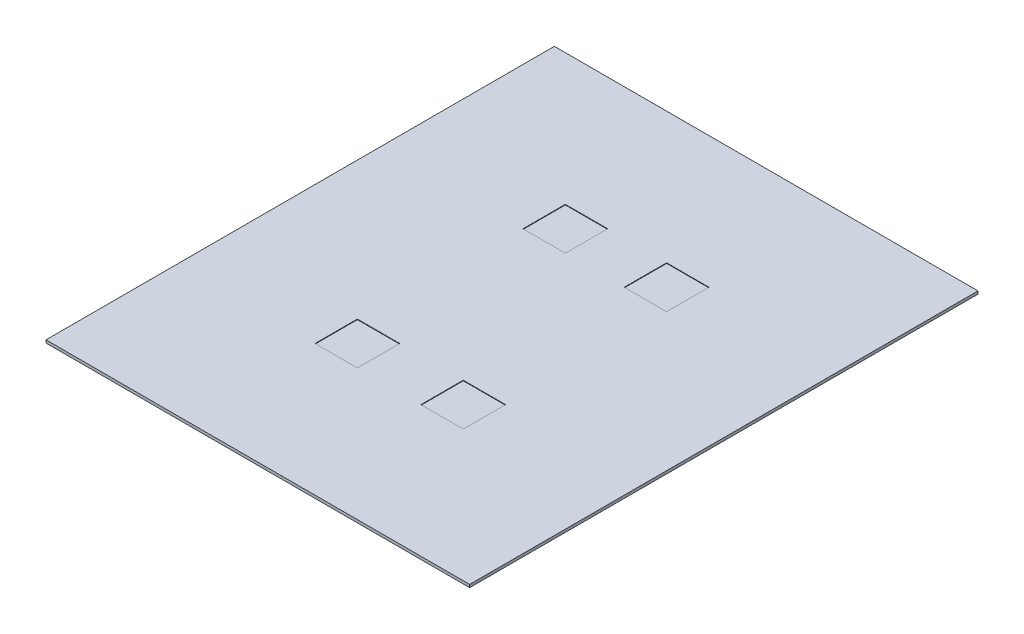
ISO-10303-21;
HEADER;
FILE_DESCRIPTION(('STEP AP214'),'2;1');
FILE_NAME('part.step','',(''),(''),'','','');
FILE_SCHEMA(('AUTOMOTIVE_DESIGN { 1 0 10303 214 1 1 1 1 }'));
ENDSEC;
DATA;
#1=APPLICATION_CONTEXT('core data for automotive mechanical design processes');
#2=APPLICATION_PROTOCOL_DEFINITION('international standard','automotive_design',2000,#1);
#3=PRODUCT_CONTEXT('',#1,'mechanical');
#4=PRODUCT('Part','Part','',(#3));
#5=PRODUCT_RELATED_PRODUCT_CATEGORY('part','',(#4));
#6=PRODUCT_DEFINITION_FORMATION('','',#4);
#7=PRODUCT_DEFINITION_CONTEXT('part definition',#1,'design');
#8=PRODUCT_DEFINITION('design','',#6,#7);
#9=PRODUCT_DEFINITION_SHAPE('','',#8);
#10=(LENGTH_UNIT() NAMED_UNIT(*) SI_UNIT(.MILLI.,.METRE.));
#11=(NAMED_UNIT(*) PLANE_ANGLE_UNIT() SI_UNIT($,.RADIAN.));
#12=(NAMED_UNIT(*) SI_UNIT($,.STERADIAN.) SOLID_ANGLE_UNIT());
#13=UNCERTAINTY_MEASURE_WITH_UNIT(LENGTH_MEASURE(1.E-05),#10,'distance_accuracy_value','');
#14=(GEOMETRIC_REPRESENTATION_CONTEXT(3) GLOBAL_UNCERTAINTY_ASSIGNED_CONTEXT((#13)) GLOBAL_UNIT_ASSIGNED_CONTEXT((#10,
#11,#12)) REPRESENTATION_CONTEXT('',''));
#15=CARTESIAN_POINT('',(0.,0.,0.));
#16=DIRECTION('',(0.,0.,1.));
#17=DIRECTION('',(1.,0.,0.));
#18=AXIS2_PLACEMENT_3D('',#15,#16,#17);
#19=CARTESIAN_POINT('',(-3750.,50.,4500.));
#20=DIRECTION('',(1.,0.,0.));
#21=DIRECTION('',(0.,0.,-1.));
#22=AXIS2_PLACEMENT_3D('',#19,#20,#21);
#23=PLANE('',#22);
#24=DIRECTION('',(0.,0.,1.));
#25=VECTOR('',#24,1.);
#26=CARTESIAN_POINT('',(-3750.,0.,4500.));
#27=LINE('',#26,#25);
#28=CARTESIAN_POINT('',(-3750.,0.,-4500.));
#29=VERTEX_POINT('',#28);
#30=CARTESIAN_POINT('',(-3750.,0.,4500.));
#31=VERTEX_POINT('',#30);
#32=EDGE_CURVE('E297',#29,#31,#27,.T.);
#33=ORIENTED_EDGE('',*,*,#32,.T.);
#34=DIRECTION('',(0.,-1.,0.));
#35=VECTOR('',#34,1.);
#36=CARTESIAN_POINT('',(-3750.,50.,4500.));
#37=LINE('',#36,#35);
#38=CARTESIAN_POINT('',(-3750.,50.,4500.));
#39=VERTEX_POINT('',#38);
#40=EDGE_CURVE('E11',#39,#31,#37,.T.);
#41=ORIENTED_EDGE('',*,*,#40,.F.);
#42=DIRECTION('',(0.,0.,1.));
#43=VECTOR('',#42,1.);
#44=CARTESIAN_POINT('',(-3750.,50.,4500.));
#45=LINE('',#44,#43);
#46=CARTESIAN_POINT('',(-3750.,50.,-4500.));
#47=VERTEX_POINT('',#46);
#48=EDGE_CURVE('E304',#47,#39,#45,.T.);
#49=ORIENTED_EDGE('',*,*,#48,.F.);
#50=DIRECTION('',(0.,-1.,0.));
#51=VECTOR('',#50,1.);
#52=CARTESIAN_POINT('',(-3750.,50.,-4500.));
#53=LINE('',#52,#51);
#54=EDGE_CURVE('E314',#47,#29,#53,.T.);
#55=ORIENTED_EDGE('',*,*,#54,.T.);
#56=EDGE_LOOP('',(#33,#41,#49,#55));
#57=FACE_BOUND('',#56,.T.);
#58=ADVANCED_FACE('F33',(#57),#23,.F.);
#59=CARTESIAN_POINT('',(3750.,50.,4500.));
#60=DIRECTION('',(0.,0.,-1.));
#61=DIRECTION('',(-1.,0.,0.));
#62=AXIS2_PLACEMENT_3D('',#59,#60,#61);
#63=PLANE('',#62);
#64=DIRECTION('',(1.,0.,0.));
#65=VECTOR('',#64,1.);
#66=CARTESIAN_POINT('',(3750.,0.,4500.));
#67=LINE('',#66,#65);
#68=CARTESIAN_POINT('',(3750.,0.,4500.));
#69=VERTEX_POINT('',#68);
#70=EDGE_CURVE('E317',#31,#69,#67,.T.);
#71=ORIENTED_EDGE('',*,*,#70,.T.);
#72=DIRECTION('',(0.,-1.,0.));
#73=VECTOR('',#72,1.);
#74=CARTESIAN_POINT('',(3750.,50.,4500.));
#75=LINE('',#74,#73);
#76=CARTESIAN_POINT('',(3750.,50.,4500.));
#77=VERTEX_POINT('',#76);
#78=EDGE_CURVE('E40',#77,#69,#75,.T.);
#79=ORIENTED_EDGE('',*,*,#78,.F.);
#80=DIRECTION('',(1.,0.,0.));
#81=VECTOR('',#80,1.);
#82=CARTESIAN_POINT('',(3750.,50.,4500.));
#83=LINE('',#82,#81);
#84=EDGE_CURVE('E307',#39,#77,#83,.T.);
#85=ORIENTED_EDGE('',*,*,#84,.F.);
#86=ORIENTED_EDGE('',*,*,#40,.T.);
#87=EDGE_LOOP('',(#71,#79,#85,#86));
#88=FACE_BOUND('',#87,.T.);
#89=ADVANCED_FACE('F347',(#88),#63,.F.);
#90=CARTESIAN_POINT('',(3750.,50.,4500.));
#91=DIRECTION('',(-1.,0.,0.));
#92=DIRECTION('',(0.,0.,1.));
#93=AXIS2_PLACEMENT_3D('',#90,#91,#92);
#94=PLANE('',#93);
#95=DIRECTION('',(0.,0.,-1.));
#96=VECTOR('',#95,1.);
#97=CARTESIAN_POINT('',(3750.,0.,4500.));
#98=LINE('',#97,#96);
#99=CARTESIAN_POINT('',(3750.,0.,-4500.));
#100=VERTEX_POINT('',#99);
#101=EDGE_CURVE('E319',#69,#100,#98,.T.);
#102=ORIENTED_EDGE('',*,*,#101,.T.);
#103=DIRECTION('',(0.,-1.,0.));
#104=VECTOR('',#103,1.);
#105=CARTESIAN_POINT('',(3750.,50.,-4500.));
#106=LINE('',#105,#104);
#107=CARTESIAN_POINT('',(3750.,50.,-4500.));
#108=VERTEX_POINT('',#107);
#109=EDGE_CURVE('E324',#108,#100,#106,.T.);
#110=ORIENTED_EDGE('',*,*,#109,.F.);
#111=DIRECTION('',(0.,0.,-1.));
#112=VECTOR('',#111,1.);
#113=CARTESIAN_POINT('',(3750.,50.,4500.));
#114=LINE('',#113,#112);
#115=EDGE_CURVE('E310',#77,#108,#114,.T.);
#116=ORIENTED_EDGE('',*,*,#115,.F.);
#117=ORIENTED_EDGE('',*,*,#78,.T.);
#118=EDGE_LOOP('',(#102,#110,#116,#117));
#119=FACE_BOUND('',#118,.T.);
#120=ADVANCED_FACE('F331',(#119),#94,.F.);
#121=CARTESIAN_POINT('',(3750.,50.,-4500.));
#122=DIRECTION('',(0.,0.,1.));
#123=DIRECTION('',(1.,0.,0.));
#124=AXIS2_PLACEMENT_3D('',#121,#122,#123);
#125=PLANE('',#124);
#126=DIRECTION('',(-1.,0.,0.));
#127=VECTOR('',#126,1.);
#128=CARTESIAN_POINT('',(3750.,0.,-4500.));
#129=LINE('',#128,#127);
#130=EDGE_CURVE('E308',#100,#29,#129,.T.);
#131=ORIENTED_EDGE('',*,*,#130,.T.);
#132=ORIENTED_EDGE('',*,*,#54,.F.);
#133=DIRECTION('',(-1.,0.,0.));
#134=VECTOR('',#133,1.);
#135=CARTESIAN_POINT('',(3750.,50.,-4500.));
#136=LINE('',#135,#134);
#137=EDGE_CURVE('E312',#108,#47,#136,.T.);
#138=ORIENTED_EDGE('',*,*,#137,.F.);
#139=ORIENTED_EDGE('',*,*,#109,.T.);
#140=EDGE_LOOP('',(#131,#132,#138,#139));
#141=FACE_BOUND('',#140,.T.);
#142=ADVANCED_FACE('F340',(#141),#125,.F.);
#143=CARTESIAN_POINT('',(0.,50.,0.));
#144=DIRECTION('',(0.,1.,0.));
#145=DIRECTION('',(0.,0.,1.));
#146=AXIS2_PLACEMENT_3D('',#143,#144,#145);
#147=PLANE('',#146);
#148=DIRECTION('',(0.,0.,1.));
#149=VECTOR('',#148,1.);
#150=CARTESIAN_POINT('',(562.499999999999,50.,-1425.));
#151=LINE('',#150,#149);
#152=CARTESIAN_POINT('',(562.499999999999,50.,-2175.));
#153=VERTEX_POINT('',#152);
#154=CARTESIAN_POINT('',(562.499999999999,50.,-1425.));
#155=VERTEX_POINT('',#154);
#156=EDGE_CURVE('E47',#153,#155,#151,.T.);
#157=ORIENTED_EDGE('',*,*,#156,.F.);
#158=DIRECTION('',(-1.,0.,0.));
#159=VECTOR('',#158,1.);
#160=CARTESIAN_POINT('',(1312.5,50.,-2175.));
#161=LINE('',#160,#159);
#162=CARTESIAN_POINT('',(1312.5,50.,-2175.));
#163=VERTEX_POINT('',#162);
#164=EDGE_CURVE('E215',#163,#153,#161,.T.);
#165=ORIENTED_EDGE('',*,*,#164,.F.);
#166=DIRECTION('',(0.,0.,-1.));
#167=VECTOR('',#166,1.);
#168=CARTESIAN_POINT('',(1312.5,50.,-1425.));
#169=LINE('',#168,#167);
#170=CARTESIAN_POINT('',(1312.5,50.,-1425.));
#171=VERTEX_POINT('',#170);
#172=EDGE_CURVE('E230',#171,#163,#169,.T.);
#173=ORIENTED_EDGE('',*,*,#172,.F.);
#174=DIRECTION('',(1.,0.,0.));
#175=VECTOR('',#174,1.);
#176=CARTESIAN_POINT('',(1312.5,50.,-1425.));
#177=LINE('',#176,#175);
#178=EDGE_CURVE('E226',#155,#171,#177,.T.);
#179=ORIENTED_EDGE('',*,*,#178,.F.);
#180=EDGE_LOOP('',(#157,#165,#173,#179));
#181=FACE_BOUND('',#180,.T.);
#182=DIRECTION('',(0.,0.,1.));
#183=VECTOR('',#182,1.);
#184=CARTESIAN_POINT('',(-1312.5,50.,2175.));
#185=LINE('',#184,#183);
#186=CARTESIAN_POINT('',(-1312.5,50.,1425.));
#187=VERTEX_POINT('',#186);
#188=CARTESIAN_POINT('',(-1312.5,50.,2175.));
#189=VERTEX_POINT('',#188);
#190=EDGE_CURVE('E55',#187,#189,#185,.T.);
#191=ORIENTED_EDGE('',*,*,#190,.F.);
#192=DIRECTION('',(-1.,0.,0.));
#193=VECTOR('',#192,1.);
#194=CARTESIAN_POINT('',(-562.5,50.,1425.));
#195=LINE('',#194,#193);
#196=CARTESIAN_POINT('',(-562.5,50.,1425.));
#197=VERTEX_POINT('',#196);
#198=EDGE_CURVE('E247',#197,#187,#195,.T.);
#199=ORIENTED_EDGE('',*,*,#198,.F.);
#200=DIRECTION('',(0.,0.,-1.));
#201=VECTOR('',#200,1.);
#202=CARTESIAN_POINT('',(-562.5,50.,2175.));
#203=LINE('',#202,#201);
#204=CARTESIAN_POINT('',(-562.5,50.,2175.));
#205=VERTEX_POINT('',#204);
#206=EDGE_CURVE('E261',#205,#197,#203,.T.);
#207=ORIENTED_EDGE('',*,*,#206,.F.);
#208=DIRECTION('',(1.,0.,0.));
#209=VECTOR('',#208,1.);
#210=CARTESIAN_POINT('',(-562.5,50.,2175.));
#211=LINE('',#210,#209);
#212=EDGE_CURVE('E258',#189,#205,#211,.T.);
#213=ORIENTED_EDGE('',*,*,#212,.F.);
#214=EDGE_LOOP('',(#191,#199,#207,#213));
#215=FACE_BOUND('',#214,.T.);
#216=DIRECTION('',(0.,0.,1.));
#217=VECTOR('',#216,1.);
#218=CARTESIAN_POINT('',(562.500000000001,50.,2175.));
#219=LINE('',#218,#217);
#220=CARTESIAN_POINT('',(562.500000000001,50.,1425.));
#221=VERTEX_POINT('',#220);
#222=CARTESIAN_POINT('',(562.500000000001,50.,2175.));
#223=VERTEX_POINT('',#222);
#224=EDGE_CURVE('E176',#221,#223,#219,.T.);
#225=ORIENTED_EDGE('',*,*,#224,.F.);
#226=DIRECTION('',(-1.,0.,0.));
#227=VECTOR('',#226,1.);
#228=CARTESIAN_POINT('',(1312.5,50.,1425.));
#229=LINE('',#228,#227);
#230=CARTESIAN_POINT('',(1312.5,50.,1425.));
#231=VERTEX_POINT('',#230);
#232=EDGE_CURVE('E193',#231,#221,#229,.T.);
#233=ORIENTED_EDGE('',*,*,#232,.F.);
#234=DIRECTION('',(0.,0.,-1.));
#235=VECTOR('',#234,1.);
#236=CARTESIAN_POINT('',(1312.5,50.,2175.));
#237=LINE('',#236,#235);
#238=CARTESIAN_POINT('',(1312.5,50.,2175.));
#239=VERTEX_POINT('',#238);
#240=EDGE_CURVE('E196',#239,#231,#237,.T.);
#241=ORIENTED_EDGE('',*,*,#240,.F.);
#242=DIRECTION('',(1.,0.,0.));
#243=VECTOR('',#242,1.);
#244=CARTESIAN_POINT('',(1312.5,50.,2175.));
#245=LINE('',#244,#243);
#246=EDGE_CURVE('E202',#223,#239,#245,.T.);
#247=ORIENTED_EDGE('',*,*,#246,.F.);
#248=EDGE_LOOP('',(#225,#233,#241,#247));
#249=FACE_BOUND('',#248,.T.);
#250=DIRECTION('',(0.,0.,1.));
#251=VECTOR('',#250,1.);
#252=CARTESIAN_POINT('',(-1230.60654802807,50.,-1425.));
#253=LINE('',#252,#251);
#254=CARTESIAN_POINT('',(-1230.60654802807,50.,-2175.));
#255=VERTEX_POINT('',#254);
#256=CARTESIAN_POINT('',(-1230.60654802807,50.,-1425.));
#257=VERTEX_POINT('',#256);
#258=EDGE_CURVE('E237',#255,#257,#253,.T.);
#259=ORIENTED_EDGE('',*,*,#258,.F.);
#260=DIRECTION('',(-1.,0.,0.));
#261=VECTOR('',#260,1.);
#262=CARTESIAN_POINT('',(-480.606548028071,50.,-2175.));
#263=LINE('',#262,#261);
#264=CARTESIAN_POINT('',(-480.606548028071,50.,-2175.));
#265=VERTEX_POINT('',#264);
#266=EDGE_CURVE('E276',#265,#255,#263,.T.);
#267=ORIENTED_EDGE('',*,*,#266,.F.);
#268=DIRECTION('',(0.,0.,-1.));
#269=VECTOR('',#268,1.);
#270=CARTESIAN_POINT('',(-480.606548028071,50.,-1425.));
#271=LINE('',#270,#269);
#272=CARTESIAN_POINT('',(-480.606548028071,50.,-1425.));
#273=VERTEX_POINT('',#272);
#274=EDGE_CURVE('E290',#273,#265,#271,.T.);
#275=ORIENTED_EDGE('',*,*,#274,.F.);
#276=DIRECTION('',(1.,0.,0.));
#277=VECTOR('',#276,1.);
#278=CARTESIAN_POINT('',(-480.606548028071,50.,-1425.));
#279=LINE('',#278,#277);
#280=EDGE_CURVE('E287',#257,#273,#279,.T.);
#281=ORIENTED_EDGE('',*,*,#280,.F.);
#282=EDGE_LOOP('',(#259,#267,#275,#281));
#283=FACE_BOUND('',#282,.T.);
#284=ORIENTED_EDGE('',*,*,#48,.T.);
#285=ORIENTED_EDGE('',*,*,#84,.T.);
#286=ORIENTED_EDGE('',*,*,#115,.T.);
#287=ORIENTED_EDGE('',*,*,#137,.T.);
#288=EDGE_LOOP('',(#284,#285,#286,#287));
#289=FACE_BOUND('',#288,.T.);
#290=ADVANCED_FACE('F346',(#181,#215,#249,#283,#289),#147,.T.);
#291=CARTESIAN_POINT('',(0.,0.,0.));
#292=DIRECTION('',(0.,1.,0.));
#293=DIRECTION('',(0.,0.,1.));
#294=AXIS2_PLACEMENT_3D('',#291,#292,#293);
#295=PLANE('',#294);
#296=ORIENTED_EDGE('',*,*,#32,.F.);
#297=ORIENTED_EDGE('',*,*,#130,.F.);
#298=ORIENTED_EDGE('',*,*,#101,.F.);
#299=ORIENTED_EDGE('',*,*,#70,.F.);
#300=EDGE_LOOP('',(#296,#297,#298,#299));
#301=FACE_BOUND('',#300,.T.);
#302=ADVANCED_FACE('F337',(#301),#295,.F.);
#303=CARTESIAN_POINT('',(-1230.60654802807,40.,-1425.));
#304=DIRECTION('',(-1.,0.,0.));
#305=DIRECTION('',(0.,0.,1.));
#306=AXIS2_PLACEMENT_3D('',#303,#304,#305);
#307=PLANE('',#306);
#308=ORIENTED_EDGE('',*,*,#258,.T.);
#309=DIRECTION('',(0.,1.,0.));
#310=VECTOR('',#309,1.);
#311=CARTESIAN_POINT('',(-1230.60654802807,40.,-1425.));
#312=LINE('',#311,#310);
#313=CARTESIAN_POINT('',(-1230.60654802807,40.,-1425.));
#314=VERTEX_POINT('',#313);
#315=EDGE_CURVE('E285',#314,#257,#312,.T.);
#316=ORIENTED_EDGE('',*,*,#315,.F.);
#317=DIRECTION('',(0.,0.,1.));
#318=VECTOR('',#317,1.);
#319=CARTESIAN_POINT('',(-1230.60654802807,40.,-1425.));
#320=LINE('',#319,#318);
#321=CARTESIAN_POINT('',(-1230.60654802807,40.,-2175.));
#322=VERTEX_POINT('',#321);
#323=EDGE_CURVE('E272',#322,#314,#320,.T.);
#324=ORIENTED_EDGE('',*,*,#323,.F.);
#325=DIRECTION('',(0.,1.,0.));
#326=VECTOR('',#325,1.);
#327=CARTESIAN_POINT('',(-1230.60654802807,40.,-2175.));
#328=LINE('',#327,#326);
#329=EDGE_CURVE('E295',#322,#255,#328,.T.);
#330=ORIENTED_EDGE('',*,*,#329,.T.);
#331=EDGE_LOOP('',(#308,#316,#324,#330));
#332=FACE_BOUND('',#331,.T.);
#333=ADVANCED_FACE('F359',(#332),#307,.F.);
#334=CARTESIAN_POINT('',(-480.606548028071,40.,-2175.));
#335=DIRECTION('',(0.,0.,-1.));
#336=DIRECTION('',(-1.,0.,0.));
#337=AXIS2_PLACEMENT_3D('',#334,#335,#336);
#338=PLANE('',#337);
#339=ORIENTED_EDGE('',*,*,#266,.T.);
#340=ORIENTED_EDGE('',*,*,#329,.F.);
#341=DIRECTION('',(-1.,0.,0.));
#342=VECTOR('',#341,1.);
#343=CARTESIAN_POINT('',(-480.606548028071,40.,-2175.));
#344=LINE('',#343,#342);
#345=CARTESIAN_POINT('',(-480.606548028071,40.,-2175.));
#346=VERTEX_POINT('',#345);
#347=EDGE_CURVE('E282',#346,#322,#344,.T.);
#348=ORIENTED_EDGE('',*,*,#347,.F.);
#349=DIRECTION('',(0.,1.,0.));
#350=VECTOR('',#349,1.);
#351=CARTESIAN_POINT('',(-480.606548028071,40.,-2175.));
#352=LINE('',#351,#350);
#353=EDGE_CURVE('E298',#346,#265,#352,.T.);
#354=ORIENTED_EDGE('',*,*,#353,.T.);
#355=EDGE_LOOP('',(#339,#340,#348,#354));
#356=FACE_BOUND('',#355,.T.);
#357=ADVANCED_FACE('F365',(#356),#338,.F.);
#358=CARTESIAN_POINT('',(-480.606548028071,40.,-1425.));
#359=DIRECTION('',(1.,0.,0.));
#360=DIRECTION('',(0.,0.,-1.));
#361=AXIS2_PLACEMENT_3D('',#358,#359,#360);
#362=PLANE('',#361);
#363=ORIENTED_EDGE('',*,*,#274,.T.);
#364=ORIENTED_EDGE('',*,*,#353,.F.);
#365=DIRECTION('',(0.,0.,-1.));
#366=VECTOR('',#365,1.);
#367=CARTESIAN_POINT('',(-480.606548028071,40.,-1425.));
#368=LINE('',#367,#366);
#369=CARTESIAN_POINT('',(-480.606548028071,40.,-1425.));
#370=VERTEX_POINT('',#369);
#371=EDGE_CURVE('E279',#370,#346,#368,.T.);
#372=ORIENTED_EDGE('',*,*,#371,.F.);
#373=DIRECTION('',(0.,1.,0.));
#374=VECTOR('',#373,1.);
#375=CARTESIAN_POINT('',(-480.606548028071,40.,-1425.));
#376=LINE('',#375,#374);
#377=EDGE_CURVE('E300',#370,#273,#376,.T.);
#378=ORIENTED_EDGE('',*,*,#377,.T.);
#379=EDGE_LOOP('',(#363,#364,#372,#378));
#380=FACE_BOUND('',#379,.T.);
#381=ADVANCED_FACE('F371',(#380),#362,.F.);
#382=CARTESIAN_POINT('',(-480.606548028071,40.,-1425.));
#383=DIRECTION('',(0.,0.,1.));
#384=DIRECTION('',(1.,0.,0.));
#385=AXIS2_PLACEMENT_3D('',#382,#383,#384);
#386=PLANE('',#385);
#387=ORIENTED_EDGE('',*,*,#280,.T.);
#388=ORIENTED_EDGE('',*,*,#377,.F.);
#389=DIRECTION('',(1.,0.,0.));
#390=VECTOR('',#389,1.);
#391=CARTESIAN_POINT('',(-480.606548028071,40.,-1425.));
#392=LINE('',#391,#390);
#393=EDGE_CURVE('E275',#314,#370,#392,.T.);
#394=ORIENTED_EDGE('',*,*,#393,.F.);
#395=ORIENTED_EDGE('',*,*,#315,.T.);
#396=EDGE_LOOP('',(#387,#388,#394,#395));
#397=FACE_BOUND('',#396,.T.);
#398=ADVANCED_FACE('F367',(#397),#386,.F.);
#399=CARTESIAN_POINT('',(0.,40.,0.));
#400=DIRECTION('',(0.,1.,0.));
#401=DIRECTION('',(0.,0.,1.));
#402=AXIS2_PLACEMENT_3D('',#399,#400,#401);
#403=PLANE('',#402);
#404=ORIENTED_EDGE('',*,*,#323,.T.);
#405=ORIENTED_EDGE('',*,*,#393,.T.);
#406=ORIENTED_EDGE('',*,*,#371,.T.);
#407=ORIENTED_EDGE('',*,*,#347,.T.);
#408=EDGE_LOOP('',(#404,#405,#406,#407));
#409=FACE_BOUND('',#408,.T.);
#410=ADVANCED_FACE('F370',(#409),#403,.T.);
#411=CARTESIAN_POINT('',(562.500000000001,40.,2175.));
#412=DIRECTION('',(-1.,0.,0.));
#413=DIRECTION('',(0.,0.,1.));
#414=AXIS2_PLACEMENT_3D('',#411,#412,#413);
#415=PLANE('',#414);
#416=ORIENTED_EDGE('',*,*,#224,.T.);
#417=DIRECTION('',(0.,1.,0.));
#418=VECTOR('',#417,1.);
#419=CARTESIAN_POINT('',(562.500000000001,40.,2175.));
#420=LINE('',#419,#418);
#421=CARTESIAN_POINT('',(562.500000000001,40.,2175.));
#422=VERTEX_POINT('',#421);
#423=EDGE_CURVE('E169',#422,#223,#420,.T.);
#424=ORIENTED_EDGE('',*,*,#423,.F.);
#425=DIRECTION('',(0.,0.,1.));
#426=VECTOR('',#425,1.);
#427=CARTESIAN_POINT('',(562.500000000001,40.,2175.));
#428=LINE('',#427,#426);
#429=CARTESIAN_POINT('',(562.500000000001,40.,1425.));
#430=VERTEX_POINT('',#429);
#431=EDGE_CURVE('E173',#430,#422,#428,.T.);
#432=ORIENTED_EDGE('',*,*,#431,.F.);
#433=DIRECTION('',(0.,1.,0.));
#434=VECTOR('',#433,1.);
#435=CARTESIAN_POINT('',(562.500000000001,40.,1425.));
#436=LINE('',#435,#434);
#437=EDGE_CURVE('E206',#430,#221,#436,.T.);
#438=ORIENTED_EDGE('',*,*,#437,.T.);
#439=EDGE_LOOP('',(#416,#424,#432,#438));
#440=FACE_BOUND('',#439,.T.);
#441=ADVANCED_FACE('F171',(#440),#415,.F.);
#442=CARTESIAN_POINT('',(1312.5,40.,1425.));
#443=DIRECTION('',(0.,0.,-1.));
#444=DIRECTION('',(-1.,0.,0.));
#445=AXIS2_PLACEMENT_3D('',#442,#443,#444);
#446=PLANE('',#445);
#447=ORIENTED_EDGE('',*,*,#232,.T.);
#448=ORIENTED_EDGE('',*,*,#437,.F.);
#449=DIRECTION('',(-1.,0.,0.));
#450=VECTOR('',#449,1.);
#451=CARTESIAN_POINT('',(1312.5,40.,1425.));
#452=LINE('',#451,#450);
#453=CARTESIAN_POINT('',(1312.5,40.,1425.));
#454=VERTEX_POINT('',#453);
#455=EDGE_CURVE('E181',#454,#430,#452,.T.);
#456=ORIENTED_EDGE('',*,*,#455,.F.);
#457=DIRECTION('',(0.,1.,0.));
#458=VECTOR('',#457,1.);
#459=CARTESIAN_POINT('',(1312.5,40.,1425.));
#460=LINE('',#459,#458);
#461=EDGE_CURVE('E208',#454,#231,#460,.T.);
#462=ORIENTED_EDGE('',*,*,#461,.T.);
#463=EDGE_LOOP('',(#447,#448,#456,#462));
#464=FACE_BOUND('',#463,.T.);
#465=ADVANCED_FACE('F422',(#464),#446,.F.);
#466=CARTESIAN_POINT('',(1312.5,40.,2175.));
#467=DIRECTION('',(1.,0.,0.));
#468=DIRECTION('',(0.,0.,-1.));
#469=AXIS2_PLACEMENT_3D('',#466,#467,#468);
#470=PLANE('',#469);
#471=ORIENTED_EDGE('',*,*,#240,.T.);
#472=ORIENTED_EDGE('',*,*,#461,.F.);
#473=DIRECTION('',(0.,0.,-1.));
#474=VECTOR('',#473,1.);
#475=CARTESIAN_POINT('',(1312.5,40.,2175.));
#476=LINE('',#475,#474);
#477=CARTESIAN_POINT('',(1312.5,40.,2175.));
#478=VERTEX_POINT('',#477);
#479=EDGE_CURVE('E189',#478,#454,#476,.T.);
#480=ORIENTED_EDGE('',*,*,#479,.F.);
#481=DIRECTION('',(0.,1.,0.));
#482=VECTOR('',#481,1.);
#483=CARTESIAN_POINT('',(1312.5,40.,2175.));
#484=LINE('',#483,#482);
#485=EDGE_CURVE('E180',#478,#239,#484,.T.);
#486=ORIENTED_EDGE('',*,*,#485,.T.);
#487=EDGE_LOOP('',(#471,#472,#480,#486));
#488=FACE_BOUND('',#487,.T.);
#489=ADVANCED_FACE('F425',(#488),#470,.F.);
#490=CARTESIAN_POINT('',(1312.5,40.,2175.));
#491=DIRECTION('',(0.,0.,1.));
#492=DIRECTION('',(1.,0.,0.));
#493=AXIS2_PLACEMENT_3D('',#490,#491,#492);
#494=PLANE('',#493);
#495=ORIENTED_EDGE('',*,*,#246,.T.);
#496=ORIENTED_EDGE('',*,*,#485,.F.);
#497=DIRECTION('',(1.,0.,0.));
#498=VECTOR('',#497,1.);
#499=CARTESIAN_POINT('',(1312.5,40.,2175.));
#500=LINE('',#499,#498);
#501=EDGE_CURVE('E184',#422,#478,#500,.T.);
#502=ORIENTED_EDGE('',*,*,#501,.F.);
#503=ORIENTED_EDGE('',*,*,#423,.T.);
#504=EDGE_LOOP('',(#495,#496,#502,#503));
#505=FACE_BOUND('',#504,.T.);
#506=ADVANCED_FACE('F185',(#505),#494,.F.);
#507=CARTESIAN_POINT('',(0.,40.,0.));
#508=DIRECTION('',(0.,1.,0.));
#509=DIRECTION('',(0.,0.,1.));
#510=AXIS2_PLACEMENT_3D('',#507,#508,#509);
#511=PLANE('',#510);
#512=ORIENTED_EDGE('',*,*,#431,.T.);
#513=ORIENTED_EDGE('',*,*,#501,.T.);
#514=ORIENTED_EDGE('',*,*,#479,.T.);
#515=ORIENTED_EDGE('',*,*,#455,.T.);
#516=EDGE_LOOP('',(#512,#513,#514,#515));
#517=FACE_BOUND('',#516,.T.);
#518=ADVANCED_FACE('F191',(#517),#511,.T.);
#519=CARTESIAN_POINT('',(-1312.5,40.,2175.));
#520=DIRECTION('',(-1.,0.,0.));
#521=DIRECTION('',(0.,0.,1.));
#522=AXIS2_PLACEMENT_3D('',#519,#520,#521);
#523=PLANE('',#522);
#524=ORIENTED_EDGE('',*,*,#190,.T.);
#525=DIRECTION('',(0.,1.,0.));
#526=VECTOR('',#525,1.);
#527=CARTESIAN_POINT('',(-1312.5,40.,2175.));
#528=LINE('',#527,#526);
#529=CARTESIAN_POINT('',(-1312.5,40.,2175.));
#530=VERTEX_POINT('',#529);
#531=EDGE_CURVE('E256',#530,#189,#528,.T.);
#532=ORIENTED_EDGE('',*,*,#531,.F.);
#533=DIRECTION('',(0.,0.,1.));
#534=VECTOR('',#533,1.);
#535=CARTESIAN_POINT('',(-1312.5,40.,2175.));
#536=LINE('',#535,#534);
#537=CARTESIAN_POINT('',(-1312.5,40.,1425.));
#538=VERTEX_POINT('',#537);
#539=EDGE_CURVE('E243',#538,#530,#536,.T.);
#540=ORIENTED_EDGE('',*,*,#539,.F.);
#541=DIRECTION('',(0.,1.,0.));
#542=VECTOR('',#541,1.);
#543=CARTESIAN_POINT('',(-1312.5,40.,1425.));
#544=LINE('',#543,#542);
#545=EDGE_CURVE('E227',#538,#187,#544,.T.);
#546=ORIENTED_EDGE('',*,*,#545,.T.);
#547=EDGE_LOOP('',(#524,#532,#540,#546));
#548=FACE_BOUND('',#547,.T.);
#549=ADVANCED_FACE('F382',(#548),#523,.F.);
#550=CARTESIAN_POINT('',(-562.5,40.,1425.));
#551=DIRECTION('',(0.,0.,-1.));
#552=DIRECTION('',(-1.,0.,0.));
#553=AXIS2_PLACEMENT_3D('',#550,#551,#552);
#554=PLANE('',#553);
#555=ORIENTED_EDGE('',*,*,#198,.T.);
#556=ORIENTED_EDGE('',*,*,#545,.F.);
#557=DIRECTION('',(-1.,0.,0.));
#558=VECTOR('',#557,1.);
#559=CARTESIAN_POINT('',(-562.5,40.,1425.));
#560=LINE('',#559,#558);
#561=CARTESIAN_POINT('',(-562.5,40.,1425.));
#562=VERTEX_POINT('',#561);
#563=EDGE_CURVE('E253',#562,#538,#560,.T.);
#564=ORIENTED_EDGE('',*,*,#563,.F.);
#565=DIRECTION('',(0.,1.,0.));
#566=VECTOR('',#565,1.);
#567=CARTESIAN_POINT('',(-562.5,40.,1425.));
#568=LINE('',#567,#566);
#569=EDGE_CURVE('E267',#562,#197,#568,.T.);
#570=ORIENTED_EDGE('',*,*,#569,.T.);
#571=EDGE_LOOP('',(#555,#556,#564,#570));
#572=FACE_BOUND('',#571,.T.);
#573=ADVANCED_FACE('F385',(#572),#554,.F.);
#574=CARTESIAN_POINT('',(-562.5,40.,2175.));
#575=DIRECTION('',(1.,0.,0.));
#576=DIRECTION('',(0.,0.,-1.));
#577=AXIS2_PLACEMENT_3D('',#574,#575,#576);
#578=PLANE('',#577);
#579=ORIENTED_EDGE('',*,*,#206,.T.);
#580=ORIENTED_EDGE('',*,*,#569,.F.);
#581=DIRECTION('',(0.,0.,-1.));
#582=VECTOR('',#581,1.);
#583=CARTESIAN_POINT('',(-562.5,40.,2175.));
#584=LINE('',#583,#582);
#585=CARTESIAN_POINT('',(-562.5,40.,2175.));
#586=VERTEX_POINT('',#585);
#587=EDGE_CURVE('E250',#586,#562,#584,.T.);
#588=ORIENTED_EDGE('',*,*,#587,.F.);
#589=DIRECTION('',(0.,1.,0.));
#590=VECTOR('',#589,1.);
#591=CARTESIAN_POINT('',(-562.5,40.,2175.));
#592=LINE('',#591,#590);
#593=EDGE_CURVE('E269',#586,#205,#592,.T.);
#594=ORIENTED_EDGE('',*,*,#593,.T.);
#595=EDGE_LOOP('',(#579,#580,#588,#594));
#596=FACE_BOUND('',#595,.T.);
#597=ADVANCED_FACE('F390',(#596),#578,.F.);
#598=CARTESIAN_POINT('',(-562.5,40.,2175.));
#599=DIRECTION('',(0.,0.,1.));
#600=DIRECTION('',(1.,0.,0.));
#601=AXIS2_PLACEMENT_3D('',#598,#599,#600);
#602=PLANE('',#601);
#603=ORIENTED_EDGE('',*,*,#212,.T.);
#604=ORIENTED_EDGE('',*,*,#593,.F.);
#605=DIRECTION('',(1.,0.,0.));
#606=VECTOR('',#605,1.);
#607=CARTESIAN_POINT('',(-562.5,40.,2175.));
#608=LINE('',#607,#606);
#609=EDGE_CURVE('E246',#530,#586,#608,.T.);
#610=ORIENTED_EDGE('',*,*,#609,.F.);
#611=ORIENTED_EDGE('',*,*,#531,.T.);
#612=EDGE_LOOP('',(#603,#604,#610,#611));
#613=FACE_BOUND('',#612,.T.);
#614=ADVANCED_FACE('F386',(#613),#602,.F.);
#615=CARTESIAN_POINT('',(0.,40.,0.));
#616=DIRECTION('',(0.,1.,0.));
#617=DIRECTION('',(0.,0.,1.));
#618=AXIS2_PLACEMENT_3D('',#615,#616,#617);
#619=PLANE('',#618);
#620=ORIENTED_EDGE('',*,*,#539,.T.);
#621=ORIENTED_EDGE('',*,*,#609,.T.);
#622=ORIENTED_EDGE('',*,*,#587,.T.);
#623=ORIENTED_EDGE('',*,*,#563,.T.);
#624=EDGE_LOOP('',(#620,#621,#622,#623));
#625=FACE_BOUND('',#624,.T.);
#626=ADVANCED_FACE('F389',(#625),#619,.T.);
#627=CARTESIAN_POINT('',(562.499999999999,40.,-1425.));
#628=DIRECTION('',(-1.,0.,0.));
#629=DIRECTION('',(0.,0.,1.));
#630=AXIS2_PLACEMENT_3D('',#627,#628,#629);
#631=PLANE('',#630);
#632=ORIENTED_EDGE('',*,*,#156,.T.);
#633=DIRECTION('',(0.,1.,0.));
#634=VECTOR('',#633,1.);
#635=CARTESIAN_POINT('',(562.499999999999,40.,-1425.));
#636=LINE('',#635,#634);
#637=CARTESIAN_POINT('',(562.499999999999,40.,-1425.));
#638=VERTEX_POINT('',#637);
#639=EDGE_CURVE('E224',#638,#155,#636,.T.);
#640=ORIENTED_EDGE('',*,*,#639,.F.);
#641=DIRECTION('',(0.,0.,1.));
#642=VECTOR('',#641,1.);
#643=CARTESIAN_POINT('',(562.499999999999,40.,-1425.));
#644=LINE('',#643,#642);
#645=CARTESIAN_POINT('',(562.499999999999,40.,-2175.));
#646=VERTEX_POINT('',#645);
#647=EDGE_CURVE('E211',#646,#638,#644,.T.);
#648=ORIENTED_EDGE('',*,*,#647,.F.);
#649=DIRECTION('',(0.,1.,0.));
#650=VECTOR('',#649,1.);
#651=CARTESIAN_POINT('',(562.499999999999,40.,-2175.));
#652=LINE('',#651,#650);
#653=EDGE_CURVE('E235',#646,#153,#652,.T.);
#654=ORIENTED_EDGE('',*,*,#653,.T.);
#655=EDGE_LOOP('',(#632,#640,#648,#654));
#656=FACE_BOUND('',#655,.T.);
#657=ADVANCED_FACE('F400',(#656),#631,.F.);
#658=CARTESIAN_POINT('',(1312.5,40.,-2175.));
#659=DIRECTION('',(0.,0.,-1.));
#660=DIRECTION('',(-1.,0.,0.));
#661=AXIS2_PLACEMENT_3D('',#658,#659,#660);
#662=PLANE('',#661);
#663=ORIENTED_EDGE('',*,*,#164,.T.);
#664=ORIENTED_EDGE('',*,*,#653,.F.);
#665=DIRECTION('',(-1.,0.,0.));
#666=VECTOR('',#665,1.);
#667=CARTESIAN_POINT('',(1312.5,40.,-2175.));
#668=LINE('',#667,#666);
#669=CARTESIAN_POINT('',(1312.5,40.,-2175.));
#670=VERTEX_POINT('',#669);
#671=EDGE_CURVE('E221',#670,#646,#668,.T.);
#672=ORIENTED_EDGE('',*,*,#671,.F.);
#673=DIRECTION('',(0.,1.,0.));
#674=VECTOR('',#673,1.);
#675=CARTESIAN_POINT('',(1312.5,40.,-2175.));
#676=LINE('',#675,#674);
#677=EDGE_CURVE('E238',#670,#163,#676,.T.);
#678=ORIENTED_EDGE('',*,*,#677,.T.);
#679=EDGE_LOOP('',(#663,#664,#672,#678));
#680=FACE_BOUND('',#679,.T.);
#681=ADVANCED_FACE('F404',(#680),#662,.F.);
#682=CARTESIAN_POINT('',(1312.5,40.,-1425.));
#683=DIRECTION('',(1.,0.,0.));
#684=DIRECTION('',(0.,0.,-1.));
#685=AXIS2_PLACEMENT_3D('',#682,#683,#684);
#686=PLANE('',#685);
#687=ORIENTED_EDGE('',*,*,#172,.T.);
#688=ORIENTED_EDGE('',*,*,#677,.F.);
#689=DIRECTION('',(0.,0.,-1.));
#690=VECTOR('',#689,1.);
#691=CARTESIAN_POINT('',(1312.5,40.,-1425.));
#692=LINE('',#691,#690);
#693=CARTESIAN_POINT('',(1312.5,40.,-1425.));
#694=VERTEX_POINT('',#693);
#695=EDGE_CURVE('E218',#694,#670,#692,.T.);
#696=ORIENTED_EDGE('',*,*,#695,.F.);
#697=DIRECTION('',(0.,1.,0.));
#698=VECTOR('',#697,1.);
#699=CARTESIAN_POINT('',(1312.5,40.,-1425.));
#700=LINE('',#699,#698);
#701=EDGE_CURVE('E240',#694,#171,#700,.T.);
#702=ORIENTED_EDGE('',*,*,#701,.T.);
#703=EDGE_LOOP('',(#687,#688,#696,#702));
#704=FACE_BOUND('',#703,.T.);
#705=ADVANCED_FACE('F409',(#704),#686,.F.);
#706=CARTESIAN_POINT('',(1312.5,40.,-1425.));
#707=DIRECTION('',(0.,0.,1.));
#708=DIRECTION('',(1.,0.,0.));
#709=AXIS2_PLACEMENT_3D('',#706,#707,#708);
#710=PLANE('',#709);
#711=ORIENTED_EDGE('',*,*,#178,.T.);
#712=ORIENTED_EDGE('',*,*,#701,.F.);
#713=DIRECTION('',(1.,0.,0.));
#714=VECTOR('',#713,1.);
#715=CARTESIAN_POINT('',(1312.5,40.,-1425.));
#716=LINE('',#715,#714);
#717=EDGE_CURVE('E214',#638,#694,#716,.T.);
#718=ORIENTED_EDGE('',*,*,#717,.F.);
#719=ORIENTED_EDGE('',*,*,#639,.T.);
#720=EDGE_LOOP('',(#711,#712,#718,#719));
#721=FACE_BOUND('',#720,.T.);
#722=ADVANCED_FACE('F405',(#721),#710,.F.);
#723=CARTESIAN_POINT('',(0.,40.,0.));
#724=DIRECTION('',(0.,1.,0.));
#725=DIRECTION('',(0.,0.,1.));
#726=AXIS2_PLACEMENT_3D('',#723,#724,#725);
#727=PLANE('',#726);
#728=ORIENTED_EDGE('',*,*,#647,.T.);
#729=ORIENTED_EDGE('',*,*,#717,.T.);
#730=ORIENTED_EDGE('',*,*,#695,.T.);
#731=ORIENTED_EDGE('',*,*,#671,.T.);
#732=EDGE_LOOP('',(#728,#729,#730,#731));
#733=FACE_BOUND('',#732,.T.);
#734=ADVANCED_FACE('F408',(#733),#727,.T.);
#735=CLOSED_SHELL('',(#58,#89,#120,#142,#290,#302,#333,#357,#381,#398,#410,#441,#465,#489,#506,
#518,#549,#573,#597,#614,#626,#657,#681,#705,#722,#734));
#736=MANIFOLD_SOLID_BREP('B2',#735);
#737=ADVANCED_BREP_SHAPE_REPRESENTATION('',(#18,#736),#14);
#738=SHAPE_DEFINITION_REPRESENTATION(#9,#737);
ENDSEC;
END-ISO-10303-21;
